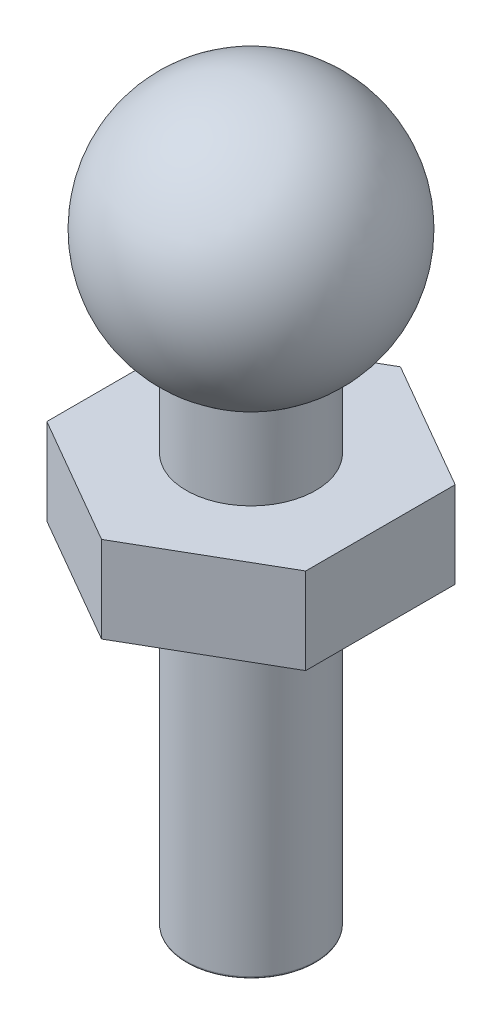
ISO-10303-21;
HEADER;
FILE_DESCRIPTION(('STEP AP214'),'2;1');
FILE_NAME('part.step','',(''),(''),'','','');
FILE_SCHEMA(('AUTOMOTIVE_DESIGN { 1 0 10303 214 1 1 1 1 }'));
ENDSEC;
DATA;
#1=APPLICATION_CONTEXT('core data for automotive mechanical design processes');
#2=APPLICATION_PROTOCOL_DEFINITION('international standard','automotive_design',2000,#1);
#3=PRODUCT_CONTEXT('',#1,'mechanical');
#4=PRODUCT('Part','Part','',(#3));
#5=PRODUCT_RELATED_PRODUCT_CATEGORY('part','',(#4));
#6=PRODUCT_DEFINITION_FORMATION('','',#4);
#7=PRODUCT_DEFINITION_CONTEXT('part definition',#1,'design');
#8=PRODUCT_DEFINITION('design','',#6,#7);
#9=PRODUCT_DEFINITION_SHAPE('','',#8);
#10=(LENGTH_UNIT() NAMED_UNIT(*) SI_UNIT(.MILLI.,.METRE.));
#11=(NAMED_UNIT(*) PLANE_ANGLE_UNIT() SI_UNIT($,.RADIAN.));
#12=(NAMED_UNIT(*) SI_UNIT($,.STERADIAN.) SOLID_ANGLE_UNIT());
#13=UNCERTAINTY_MEASURE_WITH_UNIT(LENGTH_MEASURE(1.E-05),#10,'distance_accuracy_value','');
#14=(GEOMETRIC_REPRESENTATION_CONTEXT(3) GLOBAL_UNCERTAINTY_ASSIGNED_CONTEXT((#13)) GLOBAL_UNIT_ASSIGNED_CONTEXT((#10,
#11,#12)) REPRESENTATION_CONTEXT('',''));
#15=CARTESIAN_POINT('',(0.,0.,0.));
#16=DIRECTION('',(0.,0.,1.));
#17=DIRECTION('',(1.,0.,0.));
#18=AXIS2_PLACEMENT_3D('',#15,#16,#17);
#19=CARTESIAN_POINT('',(0.,11.,0.));
#20=DIRECTION('',(0.,1.,0.));
#21=DIRECTION('',(-1.,0.,0.));
#22=AXIS2_PLACEMENT_3D('',#19,#20,#21);
#23=CYLINDRICAL_SURFACE('',#22,1.5);
#24=CARTESIAN_POINT('',(0.,0.0499999999999997,0.));
#25=DIRECTION('',(0.,1.,0.));
#26=DIRECTION('',(-1.,0.,0.));
#27=AXIS2_PLACEMENT_3D('',#24,#25,#26);
#28=CIRCLE('',#27,1.5);
#29=CARTESIAN_POINT('',(-1.5,0.0499999999999997,0.));
#30=VERTEX_POINT('',#29);
#31=EDGE_CURVE('E179',#30,#30,#28,.T.);
#32=ORIENTED_EDGE('',*,*,#31,.T.);
#33=EDGE_LOOP('',(#32));
#34=FACE_BOUND('',#33,.T.);
#35=CARTESIAN_POINT('',(0.,7.5,0.));
#36=DIRECTION('',(0.,1.,0.));
#37=DIRECTION('',(0.,0.,1.));
#38=AXIS2_PLACEMENT_3D('',#35,#36,#37);
#39=CIRCLE('',#38,1.5);
#40=CARTESIAN_POINT('',(0.,7.5,1.5));
#41=VERTEX_POINT('',#40);
#42=EDGE_CURVE('E175',#41,#41,#39,.T.);
#43=ORIENTED_EDGE('',*,*,#42,.F.);
#44=EDGE_LOOP('',(#43));
#45=FACE_BOUND('',#44,.T.);
#46=ADVANCED_FACE('F44',(#34,#45),#23,.T.);
#47=CARTESIAN_POINT('',(0.,0.,0.));
#48=DIRECTION('',(0.,1.,0.));
#49=DIRECTION('',(-1.,0.,0.));
#50=AXIS2_PLACEMENT_3D('',#47,#48,#49);
#51=PLANE('',#50);
#52=CARTESIAN_POINT('',(0.,0.,0.));
#53=DIRECTION('',(0.,1.,0.));
#54=DIRECTION('',(-1.,0.,0.));
#55=AXIS2_PLACEMENT_3D('',#52,#53,#54);
#56=CIRCLE('',#55,1.45);
#57=CARTESIAN_POINT('',(-1.45,0.,0.));
#58=VERTEX_POINT('',#57);
#59=EDGE_CURVE('E54',#58,#58,#56,.F.);
#60=ORIENTED_EDGE('',*,*,#59,.T.);
#61=EDGE_LOOP('',(#60));
#62=FACE_BOUND('',#61,.T.);
#63=ADVANCED_FACE('F186',(#62),#51,.F.);
#64=CARTESIAN_POINT('',(0.,0.0499999999999997,0.));
#65=DIRECTION('',(0.,1.,0.));
#66=DIRECTION('',(-1.,0.,0.));
#67=AXIS2_PLACEMENT_3D('',#64,#65,#66);
#68=TOROIDAL_SURFACE('',#67,1.45,0.05);
#69=ORIENTED_EDGE('',*,*,#59,.F.);
#70=EDGE_LOOP('',(#69));
#71=FACE_BOUND('',#70,.T.);
#72=ORIENTED_EDGE('',*,*,#31,.F.);
#73=EDGE_LOOP('',(#72));
#74=FACE_BOUND('',#73,.T.);
#75=ADVANCED_FACE('F46',(#71,#74),#68,.T.);
#76=CARTESIAN_POINT('',(-3.,9.5,-1.73205080756888));
#77=DIRECTION('',(-0.5,0.,-0.866025403784439));
#78=DIRECTION('',(-0.866025403784439,0.,0.5));
#79=AXIS2_PLACEMENT_3D('',#76,#77,#78);
#80=PLANE('',#79);
#81=DIRECTION('',(0.866025403784439,0.,-0.5));
#82=VECTOR('',#81,1.);
#83=CARTESIAN_POINT('',(-3.,7.5,-1.73205080756888));
#84=LINE('',#83,#82);
#85=CARTESIAN_POINT('',(-3.,7.5,-1.73205080756888));
#86=VERTEX_POINT('',#85);
#87=CARTESIAN_POINT('',(0.,7.5,-3.46410161513776));
#88=VERTEX_POINT('',#87);
#89=EDGE_CURVE('E138',#86,#88,#84,.T.);
#90=ORIENTED_EDGE('',*,*,#89,.F.);
#91=DIRECTION('',(0.,-1.,0.));
#92=VECTOR('',#91,1.);
#93=CARTESIAN_POINT('',(-3.,9.5,-1.73205080756888));
#94=LINE('',#93,#92);
#95=CARTESIAN_POINT('',(-3.,9.5,-1.73205080756888));
#96=VERTEX_POINT('',#95);
#97=EDGE_CURVE('E62',#96,#86,#94,.T.);
#98=ORIENTED_EDGE('',*,*,#97,.F.);
#99=DIRECTION('',(0.866025403784439,0.,-0.5));
#100=VECTOR('',#99,1.);
#101=CARTESIAN_POINT('',(-3.,9.5,-1.73205080756888));
#102=LINE('',#101,#100);
#103=CARTESIAN_POINT('',(0.,9.5,-3.46410161513776));
#104=VERTEX_POINT('',#103);
#105=EDGE_CURVE('E159',#96,#104,#102,.T.);
#106=ORIENTED_EDGE('',*,*,#105,.T.);
#107=DIRECTION('',(0.,-1.,0.));
#108=VECTOR('',#107,1.);
#109=CARTESIAN_POINT('',(0.,9.5,-3.46410161513776));
#110=LINE('',#109,#108);
#111=EDGE_CURVE('E97',#104,#88,#110,.T.);
#112=ORIENTED_EDGE('',*,*,#111,.T.);
#113=EDGE_LOOP('',(#90,#98,#106,#112));
#114=FACE_BOUND('',#113,.T.);
#115=ADVANCED_FACE('F190',(#114),#80,.T.);
#116=CARTESIAN_POINT('',(-3.,9.5,1.73205080756888));
#117=DIRECTION('',(-1.,0.,0.));
#118=DIRECTION('',(0.,-1.,0.));
#119=AXIS2_PLACEMENT_3D('',#116,#117,#118);
#120=PLANE('',#119);
#121=DIRECTION('',(0.,0.,-1.));
#122=VECTOR('',#121,1.);
#123=CARTESIAN_POINT('',(-3.,7.5,1.73205080756888));
#124=LINE('',#123,#122);
#125=CARTESIAN_POINT('',(-3.,7.5,1.73205080756888));
#126=VERTEX_POINT('',#125);
#127=EDGE_CURVE('E155',#126,#86,#124,.T.);
#128=ORIENTED_EDGE('',*,*,#127,.F.);
#129=DIRECTION('',(0.,-1.,0.));
#130=VECTOR('',#129,1.);
#131=CARTESIAN_POINT('',(-3.,9.5,1.73205080756888));
#132=LINE('',#131,#130);
#133=CARTESIAN_POINT('',(-3.,9.5,1.73205080756888));
#134=VERTEX_POINT('',#133);
#135=EDGE_CURVE('E85',#134,#126,#132,.T.);
#136=ORIENTED_EDGE('',*,*,#135,.F.);
#137=DIRECTION('',(0.,0.,-1.));
#138=VECTOR('',#137,1.);
#139=CARTESIAN_POINT('',(-3.,9.5,1.73205080756888));
#140=LINE('',#139,#138);
#141=EDGE_CURVE('E124',#134,#96,#140,.T.);
#142=ORIENTED_EDGE('',*,*,#141,.T.);
#143=ORIENTED_EDGE('',*,*,#97,.T.);
#144=EDGE_LOOP('',(#128,#136,#142,#143));
#145=FACE_BOUND('',#144,.T.);
#146=ADVANCED_FACE('F208',(#145),#120,.T.);
#147=CARTESIAN_POINT('',(0.,9.5,3.46410161513775));
#148=DIRECTION('',(-0.5,0.,0.866025403784439));
#149=DIRECTION('',(0.866025403784439,0.,0.5));
#150=AXIS2_PLACEMENT_3D('',#147,#148,#149);
#151=PLANE('',#150);
#152=DIRECTION('',(-0.866025403784439,0.,-0.5));
#153=VECTOR('',#152,1.);
#154=CARTESIAN_POINT('',(0.,7.5,3.46410161513775));
#155=LINE('',#154,#153);
#156=CARTESIAN_POINT('',(0.,7.5,3.46410161513775));
#157=VERTEX_POINT('',#156);
#158=EDGE_CURVE('E110',#157,#126,#155,.T.);
#159=ORIENTED_EDGE('',*,*,#158,.F.);
#160=DIRECTION('',(0.,-1.,0.));
#161=VECTOR('',#160,1.);
#162=CARTESIAN_POINT('',(0.,9.5,3.46410161513775));
#163=LINE('',#162,#161);
#164=CARTESIAN_POINT('',(0.,9.5,3.46410161513775));
#165=VERTEX_POINT('',#164);
#166=EDGE_CURVE('E105',#165,#157,#163,.T.);
#167=ORIENTED_EDGE('',*,*,#166,.F.);
#168=DIRECTION('',(-0.866025403784439,0.,-0.5));
#169=VECTOR('',#168,1.);
#170=CARTESIAN_POINT('',(0.,9.5,3.46410161513775));
#171=LINE('',#170,#169);
#172=EDGE_CURVE('E108',#165,#134,#171,.T.);
#173=ORIENTED_EDGE('',*,*,#172,.T.);
#174=ORIENTED_EDGE('',*,*,#135,.T.);
#175=EDGE_LOOP('',(#159,#167,#173,#174));
#176=FACE_BOUND('',#175,.T.);
#177=ADVANCED_FACE('F107',(#176),#151,.T.);
#178=CARTESIAN_POINT('',(3.,9.5,1.73205080756888));
#179=DIRECTION('',(0.5,0.,0.866025403784438));
#180=DIRECTION('',(0.866025403784439,0.,-0.5));
#181=AXIS2_PLACEMENT_3D('',#178,#179,#180);
#182=PLANE('',#181);
#183=DIRECTION('',(-0.866025403784438,0.,0.5));
#184=VECTOR('',#183,1.);
#185=CARTESIAN_POINT('',(3.,7.5,1.73205080756888));
#186=LINE('',#185,#184);
#187=CARTESIAN_POINT('',(3.,7.5,1.73205080756888));
#188=VERTEX_POINT('',#187);
#189=EDGE_CURVE('E150',#188,#157,#186,.T.);
#190=ORIENTED_EDGE('',*,*,#189,.F.);
#191=DIRECTION('',(0.,-1.,0.));
#192=VECTOR('',#191,1.);
#193=CARTESIAN_POINT('',(3.,9.5,1.73205080756888));
#194=LINE('',#193,#192);
#195=CARTESIAN_POINT('',(3.,9.5,1.73205080756888));
#196=VERTEX_POINT('',#195);
#197=EDGE_CURVE('E116',#196,#188,#194,.T.);
#198=ORIENTED_EDGE('',*,*,#197,.F.);
#199=DIRECTION('',(-0.866025403784438,0.,0.5));
#200=VECTOR('',#199,1.);
#201=CARTESIAN_POINT('',(3.,9.5,1.73205080756888));
#202=LINE('',#201,#200);
#203=EDGE_CURVE('E122',#196,#165,#202,.T.);
#204=ORIENTED_EDGE('',*,*,#203,.T.);
#205=ORIENTED_EDGE('',*,*,#166,.T.);
#206=EDGE_LOOP('',(#190,#198,#204,#205));
#207=FACE_BOUND('',#206,.T.);
#208=ADVANCED_FACE('F127',(#207),#182,.T.);
#209=CARTESIAN_POINT('',(3.,9.5,-1.73205080756888));
#210=DIRECTION('',(1.,0.,0.));
#211=DIRECTION('',(0.,0.,-1.));
#212=AXIS2_PLACEMENT_3D('',#209,#210,#211);
#213=PLANE('',#212);
#214=DIRECTION('',(0.,0.,1.));
#215=VECTOR('',#214,1.);
#216=CARTESIAN_POINT('',(3.,7.5,-1.73205080756888));
#217=LINE('',#216,#215);
#218=CARTESIAN_POINT('',(3.,7.5,-1.73205080756888));
#219=VERTEX_POINT('',#218);
#220=EDGE_CURVE('E146',#219,#188,#217,.T.);
#221=ORIENTED_EDGE('',*,*,#220,.F.);
#222=DIRECTION('',(0.,-1.,0.));
#223=VECTOR('',#222,1.);
#224=CARTESIAN_POINT('',(3.,9.5,-1.73205080756888));
#225=LINE('',#224,#223);
#226=CARTESIAN_POINT('',(3.,9.5,-1.73205080756888));
#227=VERTEX_POINT('',#226);
#228=EDGE_CURVE('E167',#227,#219,#225,.T.);
#229=ORIENTED_EDGE('',*,*,#228,.F.);
#230=DIRECTION('',(0.,0.,1.));
#231=VECTOR('',#230,1.);
#232=CARTESIAN_POINT('',(3.,9.5,-1.73205080756888));
#233=LINE('',#232,#231);
#234=EDGE_CURVE('E129',#227,#196,#233,.T.);
#235=ORIENTED_EDGE('',*,*,#234,.T.);
#236=ORIENTED_EDGE('',*,*,#197,.T.);
#237=EDGE_LOOP('',(#221,#229,#235,#236));
#238=FACE_BOUND('',#237,.T.);
#239=ADVANCED_FACE('F207',(#238),#213,.T.);
#240=CARTESIAN_POINT('',(0.,9.5,-3.46410161513776));
#241=DIRECTION('',(0.5,0.,-0.866025403784439));
#242=DIRECTION('',(-0.866025403784439,0.,-0.5));
#243=AXIS2_PLACEMENT_3D('',#240,#241,#242);
#244=PLANE('',#243);
#245=DIRECTION('',(0.866025403784439,0.,0.5));
#246=VECTOR('',#245,1.);
#247=CARTESIAN_POINT('',(0.,7.5,-3.46410161513776));
#248=LINE('',#247,#246);
#249=EDGE_CURVE('E142',#88,#219,#248,.T.);
#250=ORIENTED_EDGE('',*,*,#249,.F.);
#251=ORIENTED_EDGE('',*,*,#111,.F.);
#252=DIRECTION('',(0.866025403784439,0.,0.5));
#253=VECTOR('',#252,1.);
#254=CARTESIAN_POINT('',(0.,9.5,-3.46410161513776));
#255=LINE('',#254,#253);
#256=EDGE_CURVE('E132',#104,#227,#255,.T.);
#257=ORIENTED_EDGE('',*,*,#256,.T.);
#258=ORIENTED_EDGE('',*,*,#228,.T.);
#259=EDGE_LOOP('',(#250,#251,#257,#258));
#260=FACE_BOUND('',#259,.T.);
#261=ADVANCED_FACE('F204',(#260),#244,.T.);
#262=CARTESIAN_POINT('',(0.,9.5,0.));
#263=DIRECTION('',(0.,-1.,0.));
#264=DIRECTION('',(0.,0.,-1.));
#265=AXIS2_PLACEMENT_3D('',#262,#263,#264);
#266=PLANE('',#265);
#267=CARTESIAN_POINT('',(0.,9.5,0.));
#268=DIRECTION('',(0.,-1.,0.));
#269=DIRECTION('',(0.,0.,-1.));
#270=AXIS2_PLACEMENT_3D('',#267,#268,#269);
#271=CIRCLE('',#270,1.5);
#272=CARTESIAN_POINT('',(0.,9.5,-1.5));
#273=VERTEX_POINT('',#272);
#274=EDGE_CURVE('E11',#273,#273,#271,.T.);
#275=ORIENTED_EDGE('',*,*,#274,.T.);
#276=EDGE_LOOP('',(#275));
#277=FACE_BOUND('',#276,.T.);
#278=ORIENTED_EDGE('',*,*,#105,.F.);
#279=ORIENTED_EDGE('',*,*,#141,.F.);
#280=ORIENTED_EDGE('',*,*,#172,.F.);
#281=ORIENTED_EDGE('',*,*,#203,.F.);
#282=ORIENTED_EDGE('',*,*,#234,.F.);
#283=ORIENTED_EDGE('',*,*,#256,.F.);
#284=EDGE_LOOP('',(#278,#279,#280,#281,#282,#283));
#285=FACE_BOUND('',#284,.T.);
#286=ADVANCED_FACE('F120',(#277,#285),#266,.F.);
#287=CARTESIAN_POINT('',(0.,7.5,0.));
#288=DIRECTION('',(0.,-1.,0.));
#289=DIRECTION('',(0.,0.,-1.));
#290=AXIS2_PLACEMENT_3D('',#287,#288,#289);
#291=PLANE('',#290);
#292=ORIENTED_EDGE('',*,*,#42,.T.);
#293=EDGE_LOOP('',(#292));
#294=FACE_BOUND('',#293,.T.);
#295=ORIENTED_EDGE('',*,*,#89,.T.);
#296=ORIENTED_EDGE('',*,*,#249,.T.);
#297=ORIENTED_EDGE('',*,*,#220,.T.);
#298=ORIENTED_EDGE('',*,*,#189,.T.);
#299=ORIENTED_EDGE('',*,*,#158,.T.);
#300=ORIENTED_EDGE('',*,*,#127,.T.);
#301=EDGE_LOOP('',(#295,#296,#297,#298,#299,#300));
#302=FACE_BOUND('',#301,.T.);
#303=ADVANCED_FACE('F199',(#294,#302),#291,.T.);
#304=CARTESIAN_POINT('',(0.,14.,0.));
#305=DIRECTION('',(0.,1.,0.));
#306=DIRECTION('',(1.,0.,0.));
#307=AXIS2_PLACEMENT_3D('',#304,#305,#306);
#308=SPHERICAL_SURFACE('',#307,3.);
#309=CARTESIAN_POINT('',(0.,11.4019237886467,0.));
#310=DIRECTION('',(0.,1.,0.));
#311=DIRECTION('',(-1.,0.,0.));
#312=AXIS2_PLACEMENT_3D('',#309,#310,#311);
#313=CIRCLE('',#312,1.5);
#314=CARTESIAN_POINT('',(-1.5,11.4019237886467,0.));
#315=VERTEX_POINT('',#314);
#316=EDGE_CURVE('E162',#315,#315,#313,.T.);
#317=ORIENTED_EDGE('',*,*,#316,.T.);
#318=EDGE_LOOP('',(#317));
#319=FACE_BOUND('',#318,.T.);
#320=ADVANCED_FACE('F202',(#319),#308,.T.);
#321=ORIENTED_EDGE('',*,*,#316,.F.);
#322=EDGE_LOOP('',(#321));
#323=FACE_BOUND('',#322,.T.);
#324=ORIENTED_EDGE('',*,*,#274,.F.);
#325=EDGE_LOOP('',(#324));
#326=FACE_BOUND('',#325,.T.);
#327=ADVANCED_FACE('F196',(#323,#326),#23,.T.);
#328=CLOSED_SHELL('',(#46,#63,#75,#115,#146,#177,#208,#239,#261,#286,#303,#320,#327));
#329=MANIFOLD_SOLID_BREP('B2',#328);
#330=ADVANCED_BREP_SHAPE_REPRESENTATION('',(#18,#329),#14);
#331=SHAPE_DEFINITION_REPRESENTATION(#9,#330);
ENDSEC;
END-ISO-10303-21;
